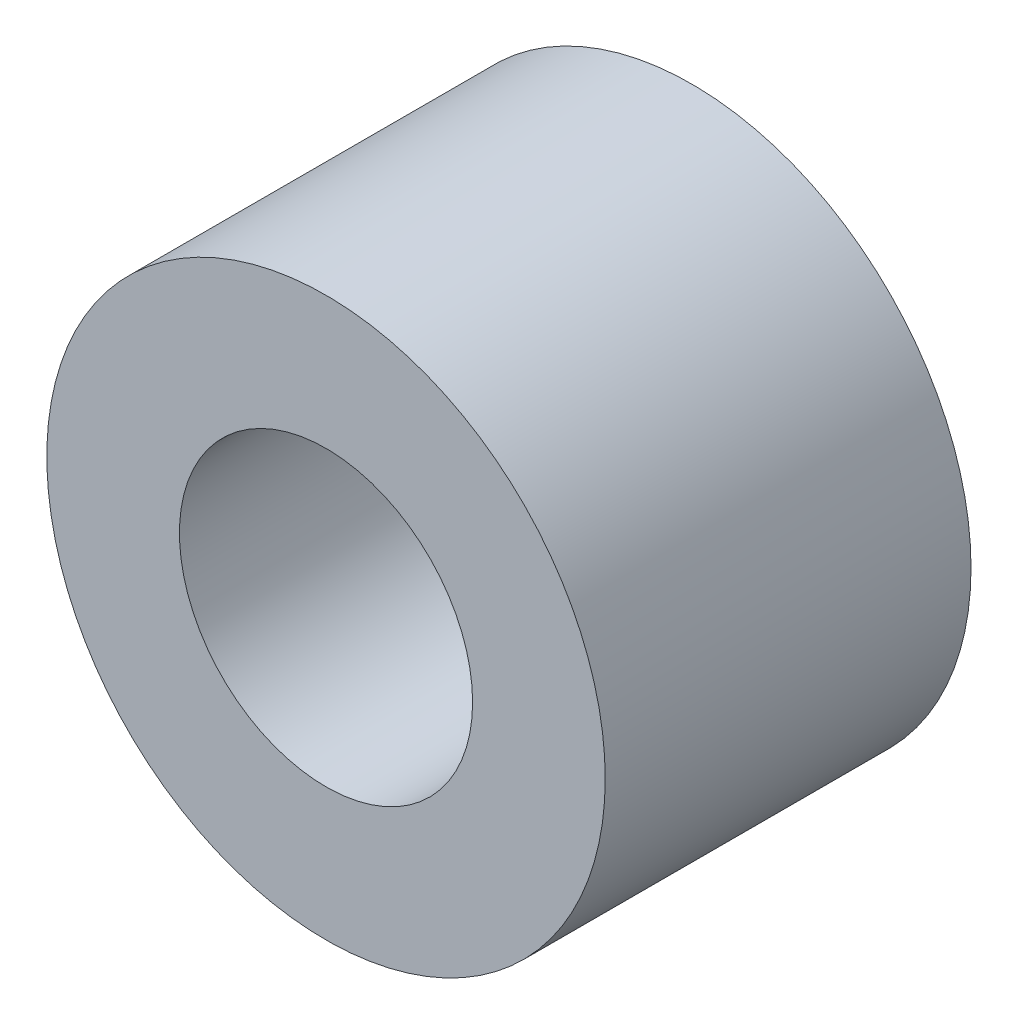
ISO-10303-21;
HEADER;
FILE_DESCRIPTION(('STEP AP214'),'2;1');
FILE_NAME('part.step','',(''),(''),'','','');
FILE_SCHEMA(('AUTOMOTIVE_DESIGN { 1 0 10303 214 1 1 1 1 }'));
ENDSEC;
DATA;
#1=APPLICATION_CONTEXT('core data for automotive mechanical design processes');
#2=APPLICATION_PROTOCOL_DEFINITION('international standard','automotive_design',2000,#1);
#3=PRODUCT_CONTEXT('',#1,'mechanical');
#4=PRODUCT('Part','Part','',(#3));
#5=PRODUCT_RELATED_PRODUCT_CATEGORY('part','',(#4));
#6=PRODUCT_DEFINITION_FORMATION('','',#4);
#7=PRODUCT_DEFINITION_CONTEXT('part definition',#1,'design');
#8=PRODUCT_DEFINITION('design','',#6,#7);
#9=PRODUCT_DEFINITION_SHAPE('','',#8);
#10=(LENGTH_UNIT() NAMED_UNIT(*) SI_UNIT(.MILLI.,.METRE.));
#11=(NAMED_UNIT(*) PLANE_ANGLE_UNIT() SI_UNIT($,.RADIAN.));
#12=(NAMED_UNIT(*) SI_UNIT($,.STERADIAN.) SOLID_ANGLE_UNIT());
#13=UNCERTAINTY_MEASURE_WITH_UNIT(LENGTH_MEASURE(1.E-05),#10,'distance_accuracy_value','');
#14=(GEOMETRIC_REPRESENTATION_CONTEXT(3) GLOBAL_UNCERTAINTY_ASSIGNED_CONTEXT((#13)) GLOBAL_UNIT_ASSIGNED_CONTEXT((#10,
#11,#12)) REPRESENTATION_CONTEXT('',''));
#15=CARTESIAN_POINT('',(0.,0.,0.));
#16=DIRECTION('',(0.,0.,1.));
#17=DIRECTION('',(1.,0.,0.));
#18=AXIS2_PLACEMENT_3D('',#15,#16,#17);
#19=CARTESIAN_POINT('',(0.,0.,2.62));
#20=DIRECTION('',(0.,0.,1.));
#21=DIRECTION('',(1.,0.,0.));
#22=AXIS2_PLACEMENT_3D('',#19,#20,#21);
#23=PLANE('',#22);
#24=CARTESIAN_POINT('',(0.,0.,2.62));
#25=DIRECTION('',(0.,0.,1.));
#26=DIRECTION('',(1.,0.,0.));
#27=AXIS2_PLACEMENT_3D('',#24,#25,#26);
#28=CIRCLE('',#27,2.);
#29=CARTESIAN_POINT('',(2.,0.,2.62));
#30=VERTEX_POINT('',#29);
#31=EDGE_CURVE('E10',#30,#30,#28,.T.);
#32=ORIENTED_EDGE('',*,*,#31,.T.);
#33=EDGE_LOOP('',(#32));
#34=FACE_BOUND('',#33,.T.);
#35=CARTESIAN_POINT('',(0.,0.,2.62));
#36=DIRECTION('',(0.,0.,1.));
#37=DIRECTION('',(1.,0.,0.));
#38=AXIS2_PLACEMENT_3D('',#35,#36,#37);
#39=CIRCLE('',#38,1.05);
#40=CARTESIAN_POINT('',(1.05,0.,2.62));
#41=VERTEX_POINT('',#40);
#42=EDGE_CURVE('E50',#41,#41,#39,.T.);
#43=ORIENTED_EDGE('',*,*,#42,.F.);
#44=EDGE_LOOP('',(#43));
#45=FACE_BOUND('',#44,.T.);
#46=ADVANCED_FACE('F37',(#34,#45),#23,.T.);
#47=CARTESIAN_POINT('',(0.,0.,0.));
#48=DIRECTION('',(0.,0.,1.));
#49=DIRECTION('',(1.,0.,0.));
#50=AXIS2_PLACEMENT_3D('',#47,#48,#49);
#51=PLANE('',#50);
#52=CARTESIAN_POINT('',(0.,0.,0.));
#53=DIRECTION('',(0.,0.,1.));
#54=DIRECTION('',(1.,0.,0.));
#55=AXIS2_PLACEMENT_3D('',#52,#53,#54);
#56=CIRCLE('',#55,2.);
#57=CARTESIAN_POINT('',(2.,0.,0.));
#58=VERTEX_POINT('',#57);
#59=EDGE_CURVE('E41',#58,#58,#56,.T.);
#60=ORIENTED_EDGE('',*,*,#59,.F.);
#61=EDGE_LOOP('',(#60));
#62=FACE_BOUND('',#61,.T.);
#63=CARTESIAN_POINT('',(0.,0.,0.));
#64=DIRECTION('',(0.,0.,1.));
#65=DIRECTION('',(1.,0.,0.));
#66=AXIS2_PLACEMENT_3D('',#63,#64,#65);
#67=CIRCLE('',#66,1.05);
#68=CARTESIAN_POINT('',(1.05,0.,0.));
#69=VERTEX_POINT('',#68);
#70=EDGE_CURVE('E52',#69,#69,#67,.T.);
#71=ORIENTED_EDGE('',*,*,#70,.T.);
#72=EDGE_LOOP('',(#71));
#73=FACE_BOUND('',#72,.T.);
#74=ADVANCED_FACE('F64',(#62,#73),#51,.F.);
#75=CARTESIAN_POINT('',(0.,0.,2.62));
#76=DIRECTION('',(0.,0.,-1.));
#77=DIRECTION('',(-1.,0.,0.));
#78=AXIS2_PLACEMENT_3D('',#75,#76,#77);
#79=CYLINDRICAL_SURFACE('',#78,2.);
#80=ORIENTED_EDGE('',*,*,#31,.F.);
#81=EDGE_LOOP('',(#80));
#82=FACE_BOUND('',#81,.T.);
#83=ORIENTED_EDGE('',*,*,#59,.T.);
#84=EDGE_LOOP('',(#83));
#85=FACE_BOUND('',#84,.T.);
#86=ADVANCED_FACE('F39',(#82,#85),#79,.T.);
#87=CARTESIAN_POINT('',(0.,0.,2.62));
#88=DIRECTION('',(0.,0.,-1.));
#89=DIRECTION('',(-1.,0.,0.));
#90=AXIS2_PLACEMENT_3D('',#87,#88,#89);
#91=CYLINDRICAL_SURFACE('',#90,1.05);
#92=ORIENTED_EDGE('',*,*,#42,.T.);
#93=EDGE_LOOP('',(#92));
#94=FACE_BOUND('',#93,.T.);
#95=ORIENTED_EDGE('',*,*,#70,.F.);
#96=EDGE_LOOP('',(#95));
#97=FACE_BOUND('',#96,.T.);
#98=ADVANCED_FACE('F60',(#94,#97),#91,.F.);
#99=CLOSED_SHELL('',(#46,#74,#86,#98));
#100=MANIFOLD_SOLID_BREP('B2',#99);
#101=ADVANCED_BREP_SHAPE_REPRESENTATION('',(#18,#100),#14);
#102=SHAPE_DEFINITION_REPRESENTATION(#9,#101);
ENDSEC;
END-ISO-10303-21;
